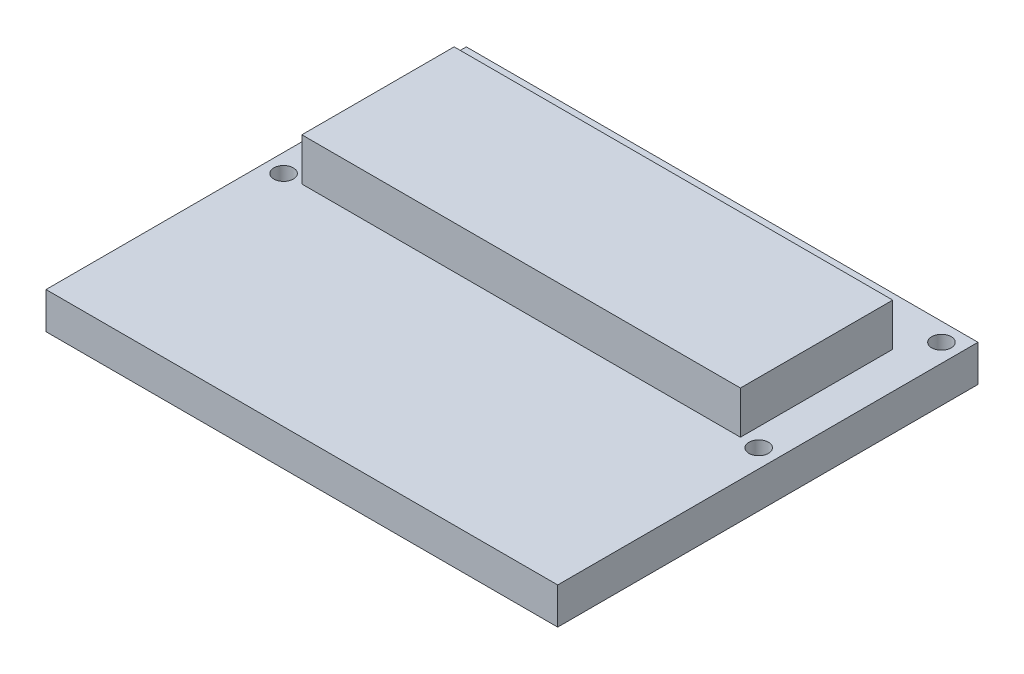
ISO-10303-21;
HEADER;
FILE_DESCRIPTION(('STEP AP214'),'2;1');
FILE_NAME('part.step','',(''),(''),'','','');
FILE_SCHEMA(('AUTOMOTIVE_DESIGN { 1 0 10303 214 1 1 1 1 }'));
ENDSEC;
DATA;
#1=APPLICATION_CONTEXT('core data for automotive mechanical design processes');
#2=APPLICATION_PROTOCOL_DEFINITION('international standard','automotive_design',2000,#1);
#3=PRODUCT_CONTEXT('',#1,'mechanical');
#4=PRODUCT('Part','Part','',(#3));
#5=PRODUCT_RELATED_PRODUCT_CATEGORY('part','',(#4));
#6=PRODUCT_DEFINITION_FORMATION('','',#4);
#7=PRODUCT_DEFINITION_CONTEXT('part definition',#1,'design');
#8=PRODUCT_DEFINITION('design','',#6,#7);
#9=PRODUCT_DEFINITION_SHAPE('','',#8);
#10=(LENGTH_UNIT() NAMED_UNIT(*) SI_UNIT(.MILLI.,.METRE.));
#11=(NAMED_UNIT(*) PLANE_ANGLE_UNIT() SI_UNIT($,.RADIAN.));
#12=(NAMED_UNIT(*) SI_UNIT($,.STERADIAN.) SOLID_ANGLE_UNIT());
#13=UNCERTAINTY_MEASURE_WITH_UNIT(LENGTH_MEASURE(1.E-05),#10,'distance_accuracy_value','');
#14=(GEOMETRIC_REPRESENTATION_CONTEXT(3) GLOBAL_UNCERTAINTY_ASSIGNED_CONTEXT((#13)) GLOBAL_UNIT_ASSIGNED_CONTEXT((#10,
#11,#12)) REPRESENTATION_CONTEXT('',''));
#15=CARTESIAN_POINT('',(0.,0.,0.));
#16=DIRECTION('',(0.,0.,1.));
#17=DIRECTION('',(1.,0.,0.));
#18=AXIS2_PLACEMENT_3D('',#15,#16,#17);
#19=CARTESIAN_POINT('',(0.,6.,0.));
#20=DIRECTION('',(0.,-1.,0.));
#21=DIRECTION('',(0.,0.,-1.));
#22=AXIS2_PLACEMENT_3D('',#19,#20,#21);
#23=PLANE('',#22);
#24=CARTESIAN_POINT('',(39.,6.,-1.5));
#25=DIRECTION('',(0.,1.,0.));
#26=DIRECTION('',(0.,0.,1.));
#27=AXIS2_PLACEMENT_3D('',#24,#25,#26);
#28=CIRCLE('',#27,1.60000000000001);
#29=CARTESIAN_POINT('',(39.,6.,0.100000000000006));
#30=VERTEX_POINT('',#29);
#31=EDGE_CURVE('E394',#30,#30,#28,.T.);
#32=ORIENTED_EDGE('',*,*,#31,.F.);
#33=EDGE_LOOP('',(#32));
#34=FACE_BOUND('',#33,.T.);
#35=CARTESIAN_POINT('',(-39.,6.,-1.5));
#36=DIRECTION('',(0.,1.,0.));
#37=DIRECTION('',(0.,0.,1.));
#38=AXIS2_PLACEMENT_3D('',#35,#36,#37);
#39=CIRCLE('',#38,1.6);
#40=CARTESIAN_POINT('',(-39.,6.,0.0999999999999977));
#41=VERTEX_POINT('',#40);
#42=EDGE_CURVE('E398',#41,#41,#39,.T.);
#43=ORIENTED_EDGE('',*,*,#42,.F.);
#44=EDGE_LOOP('',(#43));
#45=FACE_BOUND('',#44,.T.);
#46=CARTESIAN_POINT('',(39.,6.,-31.5));
#47=DIRECTION('',(0.,1.,0.));
#48=DIRECTION('',(0.,0.,1.));
#49=AXIS2_PLACEMENT_3D('',#46,#47,#48);
#50=CIRCLE('',#49,1.6);
#51=CARTESIAN_POINT('',(39.,6.,-29.9));
#52=VERTEX_POINT('',#51);
#53=EDGE_CURVE('E405',#52,#52,#50,.T.);
#54=ORIENTED_EDGE('',*,*,#53,.F.);
#55=EDGE_LOOP('',(#54));
#56=FACE_BOUND('',#55,.T.);
#57=CARTESIAN_POINT('',(-39.,6.,-31.5));
#58=DIRECTION('',(0.,1.,0.));
#59=DIRECTION('',(0.,0.,1.));
#60=AXIS2_PLACEMENT_3D('',#57,#58,#59);
#61=CIRCLE('',#60,1.6);
#62=CARTESIAN_POINT('',(-39.,6.,-29.9));
#63=VERTEX_POINT('',#62);
#64=EDGE_CURVE('E413',#63,#63,#61,.T.);
#65=ORIENTED_EDGE('',*,*,#64,.F.);
#66=EDGE_LOOP('',(#65));
#67=FACE_BOUND('',#66,.T.);
#68=DIRECTION('',(0.,0.,1.));
#69=VECTOR('',#68,1.);
#70=CARTESIAN_POINT('',(-42.,6.,-34.5));
#71=LINE('',#70,#69);
#72=CARTESIAN_POINT('',(-42.,6.,-34.5));
#73=VERTEX_POINT('',#72);
#74=CARTESIAN_POINT('',(-42.,6.,34.5));
#75=VERTEX_POINT('',#74);
#76=EDGE_CURVE('E145',#73,#75,#71,.T.);
#77=ORIENTED_EDGE('',*,*,#76,.T.);
#78=DIRECTION('',(1.,0.,0.));
#79=VECTOR('',#78,1.);
#80=CARTESIAN_POINT('',(42.,6.,34.5));
#81=LINE('',#80,#79);
#82=CARTESIAN_POINT('',(42.,6.,34.5));
#83=VERTEX_POINT('',#82);
#84=EDGE_CURVE('E149',#75,#83,#81,.T.);
#85=ORIENTED_EDGE('',*,*,#84,.T.);
#86=DIRECTION('',(0.,0.,-1.));
#87=VECTOR('',#86,1.);
#88=CARTESIAN_POINT('',(42.,6.,-34.5));
#89=LINE('',#88,#87);
#90=CARTESIAN_POINT('',(42.,6.,-34.5));
#91=VERTEX_POINT('',#90);
#92=EDGE_CURVE('E153',#83,#91,#89,.T.);
#93=ORIENTED_EDGE('',*,*,#92,.T.);
#94=DIRECTION('',(-1.,0.,0.));
#95=VECTOR('',#94,1.);
#96=CARTESIAN_POINT('',(42.,6.,-34.5));
#97=LINE('',#96,#95);
#98=EDGE_CURVE('E156',#91,#73,#97,.T.);
#99=ORIENTED_EDGE('',*,*,#98,.T.);
#100=EDGE_LOOP('',(#77,#85,#93,#99));
#101=FACE_BOUND('',#100,.T.);
#102=DIRECTION('',(0.,0.,1.));
#103=VECTOR('',#102,1.);
#104=CARTESIAN_POINT('',(-36.,6.,-26.5));
#105=LINE('',#104,#103);
#106=CARTESIAN_POINT('',(-36.,6.,-26.5));
#107=VERTEX_POINT('',#106);
#108=CARTESIAN_POINT('',(-36.,6.,-1.49999999999999));
#109=VERTEX_POINT('',#108);
#110=EDGE_CURVE('E61',#107,#109,#105,.T.);
#111=ORIENTED_EDGE('',*,*,#110,.F.);
#112=DIRECTION('',(-1.,0.,0.));
#113=VECTOR('',#112,1.);
#114=CARTESIAN_POINT('',(36.,6.,-26.5));
#115=LINE('',#114,#113);
#116=CARTESIAN_POINT('',(36.,6.,-26.5));
#117=VERTEX_POINT('',#116);
#118=EDGE_CURVE('E65',#117,#107,#115,.T.);
#119=ORIENTED_EDGE('',*,*,#118,.F.);
#120=DIRECTION('',(0.,0.,-1.));
#121=VECTOR('',#120,1.);
#122=CARTESIAN_POINT('',(36.,6.,-26.5));
#123=LINE('',#122,#121);
#124=CARTESIAN_POINT('',(36.,6.,-1.5));
#125=VERTEX_POINT('',#124);
#126=EDGE_CURVE('E434',#125,#117,#123,.T.);
#127=ORIENTED_EDGE('',*,*,#126,.F.);
#128=DIRECTION('',(1.,0.,0.));
#129=VECTOR('',#128,1.);
#130=CARTESIAN_POINT('',(36.,6.,-1.5));
#131=LINE('',#130,#129);
#132=EDGE_CURVE('E431',#109,#125,#131,.T.);
#133=ORIENTED_EDGE('',*,*,#132,.F.);
#134=EDGE_LOOP('',(#111,#119,#127,#133));
#135=FACE_BOUND('',#134,.T.);
#136=ADVANCED_FACE('F45',(#34,#45,#56,#67,#101,#135),#23,.F.);
#137=CARTESIAN_POINT('',(-42.,6.,-34.5));
#138=DIRECTION('',(1.,0.,0.));
#139=DIRECTION('',(0.,0.,-1.));
#140=AXIS2_PLACEMENT_3D('',#137,#138,#139);
#141=PLANE('',#140);
#142=DIRECTION('',(0.,0.,1.));
#143=VECTOR('',#142,1.);
#144=CARTESIAN_POINT('',(-42.,0.,-34.5));
#145=LINE('',#144,#143);
#146=CARTESIAN_POINT('',(-42.,0.,-34.5));
#147=VERTEX_POINT('',#146);
#148=CARTESIAN_POINT('',(-42.,0.,34.5));
#149=VERTEX_POINT('',#148);
#150=EDGE_CURVE('E134',#147,#149,#145,.T.);
#151=ORIENTED_EDGE('',*,*,#150,.T.);
#152=DIRECTION('',(0.,-1.,0.));
#153=VECTOR('',#152,1.);
#154=CARTESIAN_POINT('',(-42.,6.,34.5));
#155=LINE('',#154,#153);
#156=EDGE_CURVE('E11',#75,#149,#155,.T.);
#157=ORIENTED_EDGE('',*,*,#156,.F.);
#158=ORIENTED_EDGE('',*,*,#76,.F.);
#159=DIRECTION('',(0.,-1.,0.));
#160=VECTOR('',#159,1.);
#161=CARTESIAN_POINT('',(-42.,6.,-34.5));
#162=LINE('',#161,#160);
#163=EDGE_CURVE('E158',#73,#147,#162,.T.);
#164=ORIENTED_EDGE('',*,*,#163,.T.);
#165=EDGE_LOOP('',(#151,#157,#158,#164));
#166=FACE_BOUND('',#165,.T.);
#167=ADVANCED_FACE('F47',(#166),#141,.F.);
#168=CARTESIAN_POINT('',(42.,6.,34.5));
#169=DIRECTION('',(0.,0.,-1.));
#170=DIRECTION('',(-1.,0.,0.));
#171=AXIS2_PLACEMENT_3D('',#168,#169,#170);
#172=PLANE('',#171);
#173=DIRECTION('',(1.,0.,0.));
#174=VECTOR('',#173,1.);
#175=CARTESIAN_POINT('',(42.,0.,34.5));
#176=LINE('',#175,#174);
#177=CARTESIAN_POINT('',(42.,0.,34.5));
#178=VERTEX_POINT('',#177);
#179=EDGE_CURVE('E139',#149,#178,#176,.T.);
#180=ORIENTED_EDGE('',*,*,#179,.T.);
#181=DIRECTION('',(0.,-1.,0.));
#182=VECTOR('',#181,1.);
#183=CARTESIAN_POINT('',(42.,6.,34.5));
#184=LINE('',#183,#182);
#185=EDGE_CURVE('E54',#83,#178,#184,.T.);
#186=ORIENTED_EDGE('',*,*,#185,.F.);
#187=ORIENTED_EDGE('',*,*,#84,.F.);
#188=ORIENTED_EDGE('',*,*,#156,.T.);
#189=EDGE_LOOP('',(#180,#186,#187,#188));
#190=FACE_BOUND('',#189,.T.);
#191=ADVANCED_FACE('F194',(#190),#172,.F.);
#192=CARTESIAN_POINT('',(42.,6.,-34.5));
#193=DIRECTION('',(-1.,0.,0.));
#194=DIRECTION('',(0.,0.,1.));
#195=AXIS2_PLACEMENT_3D('',#192,#193,#194);
#196=PLANE('',#195);
#197=DIRECTION('',(0.,0.,-1.));
#198=VECTOR('',#197,1.);
#199=CARTESIAN_POINT('',(42.,0.,-34.5));
#200=LINE('',#199,#198);
#201=CARTESIAN_POINT('',(42.,0.,-34.5));
#202=VERTEX_POINT('',#201);
#203=EDGE_CURVE('E162',#178,#202,#200,.T.);
#204=ORIENTED_EDGE('',*,*,#203,.T.);
#205=DIRECTION('',(0.,-1.,0.));
#206=VECTOR('',#205,1.);
#207=CARTESIAN_POINT('',(42.,6.,-34.5));
#208=LINE('',#207,#206);
#209=EDGE_CURVE('E170',#91,#202,#208,.T.);
#210=ORIENTED_EDGE('',*,*,#209,.F.);
#211=ORIENTED_EDGE('',*,*,#92,.F.);
#212=ORIENTED_EDGE('',*,*,#185,.T.);
#213=EDGE_LOOP('',(#204,#210,#211,#212));
#214=FACE_BOUND('',#213,.T.);
#215=ADVANCED_FACE('F179',(#214),#196,.F.);
#216=CARTESIAN_POINT('',(42.,6.,-34.5));
#217=DIRECTION('',(0.,0.,1.));
#218=DIRECTION('',(1.,0.,0.));
#219=AXIS2_PLACEMENT_3D('',#216,#217,#218);
#220=PLANE('',#219);
#221=DIRECTION('',(-1.,0.,0.));
#222=VECTOR('',#221,1.);
#223=CARTESIAN_POINT('',(42.,0.,-34.5));
#224=LINE('',#223,#222);
#225=EDGE_CURVE('E150',#202,#147,#224,.T.);
#226=ORIENTED_EDGE('',*,*,#225,.T.);
#227=ORIENTED_EDGE('',*,*,#163,.F.);
#228=ORIENTED_EDGE('',*,*,#98,.F.);
#229=ORIENTED_EDGE('',*,*,#209,.T.);
#230=EDGE_LOOP('',(#226,#227,#228,#229));
#231=FACE_BOUND('',#230,.T.);
#232=ADVANCED_FACE('F188',(#231),#220,.F.);
#233=CARTESIAN_POINT('',(0.,0.,0.));
#234=DIRECTION('',(0.,-1.,0.));
#235=DIRECTION('',(0.,0.,-1.));
#236=AXIS2_PLACEMENT_3D('',#233,#234,#235);
#237=PLANE('',#236);
#238=CARTESIAN_POINT('',(39.,0.,-1.5));
#239=DIRECTION('',(0.,1.,0.));
#240=DIRECTION('',(0.,0.,1.));
#241=AXIS2_PLACEMENT_3D('',#238,#239,#240);
#242=CIRCLE('',#241,1.60000000000001);
#243=CARTESIAN_POINT('',(39.,0.,0.100000000000006));
#244=VERTEX_POINT('',#243);
#245=EDGE_CURVE('E392',#244,#244,#242,.T.);
#246=ORIENTED_EDGE('',*,*,#245,.T.);
#247=EDGE_LOOP('',(#246));
#248=FACE_BOUND('',#247,.T.);
#249=CARTESIAN_POINT('',(-39.,0.,-1.5));
#250=DIRECTION('',(0.,1.,0.));
#251=DIRECTION('',(0.,0.,1.));
#252=AXIS2_PLACEMENT_3D('',#249,#250,#251);
#253=CIRCLE('',#252,1.6);
#254=CARTESIAN_POINT('',(-39.,0.,0.0999999999999977));
#255=VERTEX_POINT('',#254);
#256=EDGE_CURVE('E401',#255,#255,#253,.T.);
#257=ORIENTED_EDGE('',*,*,#256,.T.);
#258=EDGE_LOOP('',(#257));
#259=FACE_BOUND('',#258,.T.);
#260=CARTESIAN_POINT('',(39.,0.,-31.5));
#261=DIRECTION('',(0.,1.,0.));
#262=DIRECTION('',(0.,0.,1.));
#263=AXIS2_PLACEMENT_3D('',#260,#261,#262);
#264=CIRCLE('',#263,1.6);
#265=CARTESIAN_POINT('',(39.,0.,-29.9));
#266=VERTEX_POINT('',#265);
#267=EDGE_CURVE('E409',#266,#266,#264,.T.);
#268=ORIENTED_EDGE('',*,*,#267,.T.);
#269=EDGE_LOOP('',(#268));
#270=FACE_BOUND('',#269,.T.);
#271=CARTESIAN_POINT('',(-39.,0.,-31.5));
#272=DIRECTION('',(0.,1.,0.));
#273=DIRECTION('',(0.,0.,1.));
#274=AXIS2_PLACEMENT_3D('',#271,#272,#273);
#275=CIRCLE('',#274,1.6);
#276=CARTESIAN_POINT('',(-39.,0.,-29.9));
#277=VERTEX_POINT('',#276);
#278=EDGE_CURVE('E417',#277,#277,#275,.T.);
#279=ORIENTED_EDGE('',*,*,#278,.T.);
#280=EDGE_LOOP('',(#279));
#281=FACE_BOUND('',#280,.T.);
#282=ORIENTED_EDGE('',*,*,#150,.F.);
#283=ORIENTED_EDGE('',*,*,#225,.F.);
#284=ORIENTED_EDGE('',*,*,#203,.F.);
#285=ORIENTED_EDGE('',*,*,#179,.F.);
#286=EDGE_LOOP('',(#282,#283,#284,#285));
#287=FACE_BOUND('',#286,.T.);
#288=ADVANCED_FACE('F185',(#248,#259,#270,#281,#287),#237,.T.);
#289=CARTESIAN_POINT('',(-36.,13.,-26.5));
#290=DIRECTION('',(1.,0.,0.));
#291=DIRECTION('',(0.,0.,-1.));
#292=AXIS2_PLACEMENT_3D('',#289,#290,#291);
#293=PLANE('',#292);
#294=ORIENTED_EDGE('',*,*,#110,.T.);
#295=DIRECTION('',(0.,-1.,0.));
#296=VECTOR('',#295,1.);
#297=CARTESIAN_POINT('',(-36.,13.,-1.49999999999999));
#298=LINE('',#297,#296);
#299=CARTESIAN_POINT('',(-36.,13.,-1.49999999999999));
#300=VERTEX_POINT('',#299);
#301=EDGE_CURVE('E114',#300,#109,#298,.T.);
#302=ORIENTED_EDGE('',*,*,#301,.F.);
#303=DIRECTION('',(0.,0.,1.));
#304=VECTOR('',#303,1.);
#305=CARTESIAN_POINT('',(-36.,13.,-26.5));
#306=LINE('',#305,#304);
#307=CARTESIAN_POINT('',(-36.,13.,-26.5));
#308=VERTEX_POINT('',#307);
#309=EDGE_CURVE('E121',#308,#300,#306,.T.);
#310=ORIENTED_EDGE('',*,*,#309,.F.);
#311=DIRECTION('',(0.,-1.,0.));
#312=VECTOR('',#311,1.);
#313=CARTESIAN_POINT('',(-36.,13.,-26.5));
#314=LINE('',#313,#312);
#315=EDGE_CURVE('E428',#308,#107,#314,.T.);
#316=ORIENTED_EDGE('',*,*,#315,.T.);
#317=EDGE_LOOP('',(#294,#302,#310,#316));
#318=FACE_BOUND('',#317,.T.);
#319=ADVANCED_FACE('F132',(#318),#293,.F.);
#320=CARTESIAN_POINT('',(36.,13.,-1.5));
#321=DIRECTION('',(0.,0.,-1.));
#322=DIRECTION('',(-1.,0.,0.));
#323=AXIS2_PLACEMENT_3D('',#320,#321,#322);
#324=PLANE('',#323);
#325=ORIENTED_EDGE('',*,*,#132,.T.);
#326=DIRECTION('',(0.,-1.,0.));
#327=VECTOR('',#326,1.);
#328=CARTESIAN_POINT('',(36.,13.,-1.5));
#329=LINE('',#328,#327);
#330=CARTESIAN_POINT('',(36.,13.,-1.5));
#331=VERTEX_POINT('',#330);
#332=EDGE_CURVE('E116',#331,#125,#329,.T.);
#333=ORIENTED_EDGE('',*,*,#332,.F.);
#334=DIRECTION('',(1.,0.,0.));
#335=VECTOR('',#334,1.);
#336=CARTESIAN_POINT('',(36.,13.,-1.5));
#337=LINE('',#336,#335);
#338=EDGE_CURVE('E109',#300,#331,#337,.T.);
#339=ORIENTED_EDGE('',*,*,#338,.F.);
#340=ORIENTED_EDGE('',*,*,#301,.T.);
#341=EDGE_LOOP('',(#325,#333,#339,#340));
#342=FACE_BOUND('',#341,.T.);
#343=ADVANCED_FACE('F112',(#342),#324,.F.);
#344=CARTESIAN_POINT('',(36.,13.,-26.5));
#345=DIRECTION('',(-1.,0.,0.));
#346=DIRECTION('',(0.,0.,1.));
#347=AXIS2_PLACEMENT_3D('',#344,#345,#346);
#348=PLANE('',#347);
#349=ORIENTED_EDGE('',*,*,#126,.T.);
#350=DIRECTION('',(0.,-1.,0.));
#351=VECTOR('',#350,1.);
#352=CARTESIAN_POINT('',(36.,13.,-26.5));
#353=LINE('',#352,#351);
#354=CARTESIAN_POINT('',(36.,13.,-26.5));
#355=VERTEX_POINT('',#354);
#356=EDGE_CURVE('E141',#355,#117,#353,.T.);
#357=ORIENTED_EDGE('',*,*,#356,.F.);
#358=DIRECTION('',(0.,0.,-1.));
#359=VECTOR('',#358,1.);
#360=CARTESIAN_POINT('',(36.,13.,-26.5));
#361=LINE('',#360,#359);
#362=EDGE_CURVE('E120',#331,#355,#361,.T.);
#363=ORIENTED_EDGE('',*,*,#362,.F.);
#364=ORIENTED_EDGE('',*,*,#332,.T.);
#365=EDGE_LOOP('',(#349,#357,#363,#364));
#366=FACE_BOUND('',#365,.T.);
#367=ADVANCED_FACE('F234',(#366),#348,.F.);
#368=CARTESIAN_POINT('',(36.,13.,-26.5));
#369=DIRECTION('',(0.,0.,1.));
#370=DIRECTION('',(1.,0.,0.));
#371=AXIS2_PLACEMENT_3D('',#368,#369,#370);
#372=PLANE('',#371);
#373=ORIENTED_EDGE('',*,*,#118,.T.);
#374=ORIENTED_EDGE('',*,*,#315,.F.);
#375=DIRECTION('',(-1.,0.,0.));
#376=VECTOR('',#375,1.);
#377=CARTESIAN_POINT('',(36.,13.,-26.5));
#378=LINE('',#377,#376);
#379=EDGE_CURVE('E126',#355,#308,#378,.T.);
#380=ORIENTED_EDGE('',*,*,#379,.F.);
#381=ORIENTED_EDGE('',*,*,#356,.T.);
#382=EDGE_LOOP('',(#373,#374,#380,#381));
#383=FACE_BOUND('',#382,.T.);
#384=ADVANCED_FACE('F240',(#383),#372,.F.);
#385=CARTESIAN_POINT('',(0.,13.,0.));
#386=DIRECTION('',(0.,-1.,0.));
#387=DIRECTION('',(0.,0.,-1.));
#388=AXIS2_PLACEMENT_3D('',#385,#386,#387);
#389=PLANE('',#388);
#390=ORIENTED_EDGE('',*,*,#309,.T.);
#391=ORIENTED_EDGE('',*,*,#338,.T.);
#392=ORIENTED_EDGE('',*,*,#362,.T.);
#393=ORIENTED_EDGE('',*,*,#379,.T.);
#394=EDGE_LOOP('',(#390,#391,#392,#393));
#395=FACE_BOUND('',#394,.T.);
#396=ADVANCED_FACE('F124',(#395),#389,.F.);
#397=CARTESIAN_POINT('',(-39.,0.,-31.5));
#398=DIRECTION('',(0.,1.,0.));
#399=DIRECTION('',(0.,0.,1.));
#400=AXIS2_PLACEMENT_3D('',#397,#398,#399);
#401=CYLINDRICAL_SURFACE('',#400,1.6);
#402=ORIENTED_EDGE('',*,*,#278,.F.);
#403=EDGE_LOOP('',(#402));
#404=FACE_BOUND('',#403,.T.);
#405=ORIENTED_EDGE('',*,*,#64,.T.);
#406=EDGE_LOOP('',(#405));
#407=FACE_BOUND('',#406,.T.);
#408=ADVANCED_FACE('F255',(#404,#407),#401,.F.);
#409=CARTESIAN_POINT('',(39.,0.,-31.5));
#410=DIRECTION('',(0.,1.,0.));
#411=DIRECTION('',(0.,0.,1.));
#412=AXIS2_PLACEMENT_3D('',#409,#410,#411);
#413=CYLINDRICAL_SURFACE('',#412,1.6);
#414=ORIENTED_EDGE('',*,*,#267,.F.);
#415=EDGE_LOOP('',(#414));
#416=FACE_BOUND('',#415,.T.);
#417=ORIENTED_EDGE('',*,*,#53,.T.);
#418=EDGE_LOOP('',(#417));
#419=FACE_BOUND('',#418,.T.);
#420=ADVANCED_FACE('F262',(#416,#419),#413,.F.);
#421=CARTESIAN_POINT('',(-39.,0.,-1.5));
#422=DIRECTION('',(0.,1.,0.));
#423=DIRECTION('',(0.,0.,1.));
#424=AXIS2_PLACEMENT_3D('',#421,#422,#423);
#425=CYLINDRICAL_SURFACE('',#424,1.6);
#426=ORIENTED_EDGE('',*,*,#256,.F.);
#427=EDGE_LOOP('',(#426));
#428=FACE_BOUND('',#427,.T.);
#429=ORIENTED_EDGE('',*,*,#42,.T.);
#430=EDGE_LOOP('',(#429));
#431=FACE_BOUND('',#430,.T.);
#432=ADVANCED_FACE('F270',(#428,#431),#425,.F.);
#433=CARTESIAN_POINT('',(39.,0.,-1.5));
#434=DIRECTION('',(0.,1.,0.));
#435=DIRECTION('',(0.,0.,1.));
#436=AXIS2_PLACEMENT_3D('',#433,#434,#435);
#437=CYLINDRICAL_SURFACE('',#436,1.60000000000001);
#438=ORIENTED_EDGE('',*,*,#245,.F.);
#439=EDGE_LOOP('',(#438));
#440=FACE_BOUND('',#439,.T.);
#441=ORIENTED_EDGE('',*,*,#31,.T.);
#442=EDGE_LOOP('',(#441));
#443=FACE_BOUND('',#442,.T.);
#444=ADVANCED_FACE('F278',(#440,#443),#437,.F.);
#445=CLOSED_SHELL('',(#136,#167,#191,#215,#232,#288,#319,#343,#367,#384,#396,#408,#420,#432,#444));
#446=MANIFOLD_SOLID_BREP('B2',#445);
#447=ADVANCED_BREP_SHAPE_REPRESENTATION('',(#18,#446),#14);
#448=SHAPE_DEFINITION_REPRESENTATION(#9,#447);
ENDSEC;
END-ISO-10303-21;
